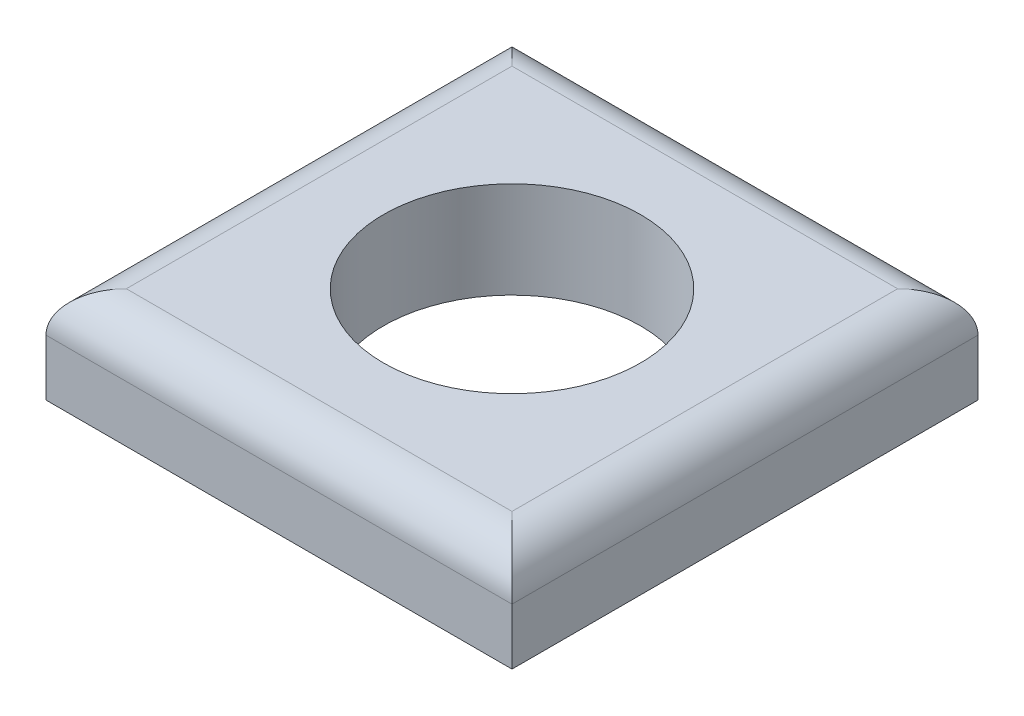
ISO-10303-21;
HEADER;
FILE_DESCRIPTION(('STEP AP214'),'2;1');
FILE_NAME('part.step','',(''),(''),'','','');
FILE_SCHEMA(('AUTOMOTIVE_DESIGN { 1 0 10303 214 1 1 1 1 }'));
ENDSEC;
DATA;
#1=APPLICATION_CONTEXT('core data for automotive mechanical design processes');
#2=APPLICATION_PROTOCOL_DEFINITION('international standard','automotive_design',2000,#1);
#3=PRODUCT_CONTEXT('',#1,'mechanical');
#4=PRODUCT('Part','Part','',(#3));
#5=PRODUCT_RELATED_PRODUCT_CATEGORY('part','',(#4));
#6=PRODUCT_DEFINITION_FORMATION('','',#4);
#7=PRODUCT_DEFINITION_CONTEXT('part definition',#1,'design');
#8=PRODUCT_DEFINITION('design','',#6,#7);
#9=PRODUCT_DEFINITION_SHAPE('','',#8);
#10=(LENGTH_UNIT() NAMED_UNIT(*) SI_UNIT(.MILLI.,.METRE.));
#11=(NAMED_UNIT(*) PLANE_ANGLE_UNIT() SI_UNIT($,.RADIAN.));
#12=(NAMED_UNIT(*) SI_UNIT($,.STERADIAN.) SOLID_ANGLE_UNIT());
#13=UNCERTAINTY_MEASURE_WITH_UNIT(LENGTH_MEASURE(1.E-05),#10,'distance_accuracy_value','');
#14=(GEOMETRIC_REPRESENTATION_CONTEXT(3) GLOBAL_UNCERTAINTY_ASSIGNED_CONTEXT((#13)) GLOBAL_UNIT_ASSIGNED_CONTEXT((#10,
#11,#12)) REPRESENTATION_CONTEXT('',''));
#15=CARTESIAN_POINT('',(0.,0.,0.));
#16=DIRECTION('',(0.,0.,1.));
#17=DIRECTION('',(1.,0.,0.));
#18=AXIS2_PLACEMENT_3D('',#15,#16,#17);
#19=CARTESIAN_POINT('',(-2.9,1.2,-2.9));
#20=DIRECTION('',(1.,0.,0.));
#21=DIRECTION('',(0.,0.,-1.));
#22=AXIS2_PLACEMENT_3D('',#19,#20,#21);
#23=PLANE('',#22);
#24=DIRECTION('',(0.,-1.,0.));
#25=VECTOR('',#24,1.);
#26=CARTESIAN_POINT('',(-2.9,1.2,2.9));
#27=LINE('',#26,#25);
#28=CARTESIAN_POINT('',(-2.9,0.7,2.9));
#29=VERTEX_POINT('',#28);
#30=CARTESIAN_POINT('',(-2.9,0.,2.9));
#31=VERTEX_POINT('',#30);
#32=EDGE_CURVE('E82',#29,#31,#27,.T.);
#33=ORIENTED_EDGE('',*,*,#32,.F.);
#34=DIRECTION('',(0.,0.,1.));
#35=VECTOR('',#34,1.);
#36=CARTESIAN_POINT('',(-2.9,0.7,-2.9));
#37=LINE('',#36,#35);
#38=CARTESIAN_POINT('',(-2.9,0.7,-2.9));
#39=VERTEX_POINT('',#38);
#40=EDGE_CURVE('E11',#29,#39,#37,.F.);
#41=ORIENTED_EDGE('',*,*,#40,.T.);
#42=DIRECTION('',(0.,-1.,0.));
#43=VECTOR('',#42,1.);
#44=CARTESIAN_POINT('',(-2.9,1.2,-2.9));
#45=LINE('',#44,#43);
#46=CARTESIAN_POINT('',(-2.9,0.,-2.9));
#47=VERTEX_POINT('',#46);
#48=EDGE_CURVE('E102',#39,#47,#45,.T.);
#49=ORIENTED_EDGE('',*,*,#48,.T.);
#50=DIRECTION('',(0.,0.,1.));
#51=VECTOR('',#50,1.);
#52=CARTESIAN_POINT('',(-2.9,0.,-2.9));
#53=LINE('',#52,#51);
#54=EDGE_CURVE('E98',#47,#31,#53,.T.);
#55=ORIENTED_EDGE('',*,*,#54,.T.);
#56=EDGE_LOOP('',(#33,#41,#49,#55));
#57=FACE_BOUND('',#56,.T.);
#58=ADVANCED_FACE('F32',(#57),#23,.F.);
#59=CARTESIAN_POINT('',(-2.9,1.2,2.9));
#60=DIRECTION('',(0.,0.,-1.));
#61=DIRECTION('',(-1.,0.,0.));
#62=AXIS2_PLACEMENT_3D('',#59,#60,#61);
#63=PLANE('',#62);
#64=DIRECTION('',(0.,-1.,0.));
#65=VECTOR('',#64,1.);
#66=CARTESIAN_POINT('',(2.9,1.2,2.9));
#67=LINE('',#66,#65);
#68=CARTESIAN_POINT('',(2.9,0.7,2.9));
#69=VERTEX_POINT('',#68);
#70=CARTESIAN_POINT('',(2.9,0.,2.9));
#71=VERTEX_POINT('',#70);
#72=EDGE_CURVE('E92',#69,#71,#67,.T.);
#73=ORIENTED_EDGE('',*,*,#72,.F.);
#74=DIRECTION('',(1.,0.,0.));
#75=VECTOR('',#74,1.);
#76=CARTESIAN_POINT('',(-2.9,0.7,2.9));
#77=LINE('',#76,#75);
#78=EDGE_CURVE('E89',#69,#29,#77,.F.);
#79=ORIENTED_EDGE('',*,*,#78,.T.);
#80=ORIENTED_EDGE('',*,*,#32,.T.);
#81=DIRECTION('',(1.,0.,0.));
#82=VECTOR('',#81,1.);
#83=CARTESIAN_POINT('',(-2.9,0.,2.9));
#84=LINE('',#83,#82);
#85=EDGE_CURVE('E86',#31,#71,#84,.T.);
#86=ORIENTED_EDGE('',*,*,#85,.T.);
#87=EDGE_LOOP('',(#73,#79,#80,#86));
#88=FACE_BOUND('',#87,.T.);
#89=ADVANCED_FACE('F85',(#88),#63,.F.);
#90=CARTESIAN_POINT('',(2.9,1.2,-2.9));
#91=DIRECTION('',(-1.,0.,0.));
#92=DIRECTION('',(0.,0.,1.));
#93=AXIS2_PLACEMENT_3D('',#90,#91,#92);
#94=PLANE('',#93);
#95=DIRECTION('',(0.,-1.,0.));
#96=VECTOR('',#95,1.);
#97=CARTESIAN_POINT('',(2.9,1.2,-2.9));
#98=LINE('',#97,#96);
#99=CARTESIAN_POINT('',(2.9,0.7,-2.9));
#100=VERTEX_POINT('',#99);
#101=CARTESIAN_POINT('',(2.9,0.,-2.9));
#102=VERTEX_POINT('',#101);
#103=EDGE_CURVE('E115',#100,#102,#98,.T.);
#104=ORIENTED_EDGE('',*,*,#103,.F.);
#105=DIRECTION('',(0.,0.,-1.));
#106=VECTOR('',#105,1.);
#107=CARTESIAN_POINT('',(2.9,0.7,2.9));
#108=LINE('',#107,#106);
#109=EDGE_CURVE('E127',#100,#69,#108,.F.);
#110=ORIENTED_EDGE('',*,*,#109,.T.);
#111=ORIENTED_EDGE('',*,*,#72,.T.);
#112=DIRECTION('',(0.,0.,-1.));
#113=VECTOR('',#112,1.);
#114=CARTESIAN_POINT('',(2.9,0.,-2.9));
#115=LINE('',#114,#113);
#116=EDGE_CURVE('E100',#71,#102,#115,.T.);
#117=ORIENTED_EDGE('',*,*,#116,.T.);
#118=EDGE_LOOP('',(#104,#110,#111,#117));
#119=FACE_BOUND('',#118,.T.);
#120=ADVANCED_FACE('F130',(#119),#94,.F.);
#121=CARTESIAN_POINT('',(-2.9,1.2,-2.9));
#122=DIRECTION('',(0.,0.,1.));
#123=DIRECTION('',(1.,0.,0.));
#124=AXIS2_PLACEMENT_3D('',#121,#122,#123);
#125=PLANE('',#124);
#126=ORIENTED_EDGE('',*,*,#48,.F.);
#127=DIRECTION('',(-1.,0.,0.));
#128=VECTOR('',#127,1.);
#129=CARTESIAN_POINT('',(2.9,0.7,-2.9));
#130=LINE('',#129,#128);
#131=EDGE_CURVE('E39',#39,#100,#130,.F.);
#132=ORIENTED_EDGE('',*,*,#131,.T.);
#133=ORIENTED_EDGE('',*,*,#103,.T.);
#134=DIRECTION('',(-1.,0.,0.));
#135=VECTOR('',#134,1.);
#136=CARTESIAN_POINT('',(-2.9,0.,-2.9));
#137=LINE('',#136,#135);
#138=EDGE_CURVE('E112',#102,#47,#137,.T.);
#139=ORIENTED_EDGE('',*,*,#138,.T.);
#140=EDGE_LOOP('',(#126,#132,#133,#139));
#141=FACE_BOUND('',#140,.T.);
#142=ADVANCED_FACE('F157',(#141),#125,.F.);
#143=CARTESIAN_POINT('',(-2.9,1.2,2.9));
#144=DIRECTION('',(0.,1.,0.));
#145=DIRECTION('',(0.,0.,1.));
#146=AXIS2_PLACEMENT_3D('',#143,#144,#145);
#147=PLANE('',#146);
#148=DIRECTION('',(0.,0.,1.));
#149=VECTOR('',#148,1.);
#150=CARTESIAN_POINT('',(-2.4,1.2,2.9));
#151=LINE('',#150,#149);
#152=CARTESIAN_POINT('',(-2.4,1.2,-2.4));
#153=VERTEX_POINT('',#152);
#154=CARTESIAN_POINT('',(-2.4,1.2,2.4));
#155=VERTEX_POINT('',#154);
#156=EDGE_CURVE('E91',#153,#155,#151,.T.);
#157=ORIENTED_EDGE('',*,*,#156,.T.);
#158=DIRECTION('',(1.,0.,0.));
#159=VECTOR('',#158,1.);
#160=CARTESIAN_POINT('',(2.9,1.2,2.4));
#161=LINE('',#160,#159);
#162=CARTESIAN_POINT('',(2.4,1.2,2.4));
#163=VERTEX_POINT('',#162);
#164=EDGE_CURVE('E123',#155,#163,#161,.T.);
#165=ORIENTED_EDGE('',*,*,#164,.T.);
#166=DIRECTION('',(0.,0.,-1.));
#167=VECTOR('',#166,1.);
#168=CARTESIAN_POINT('',(2.4,1.2,-2.9));
#169=LINE('',#168,#167);
#170=CARTESIAN_POINT('',(2.4,1.2,-2.4));
#171=VERTEX_POINT('',#170);
#172=EDGE_CURVE('E121',#163,#171,#169,.T.);
#173=ORIENTED_EDGE('',*,*,#172,.T.);
#174=DIRECTION('',(-1.,0.,0.));
#175=VECTOR('',#174,1.);
#176=CARTESIAN_POINT('',(-2.9,1.2,-2.4));
#177=LINE('',#176,#175);
#178=EDGE_CURVE('E119',#171,#153,#177,.T.);
#179=ORIENTED_EDGE('',*,*,#178,.T.);
#180=EDGE_LOOP('',(#157,#165,#173,#179));
#181=FACE_BOUND('',#180,.T.);
#182=CARTESIAN_POINT('',(0.,1.2,0.));
#183=DIRECTION('',(0.,1.,0.));
#184=DIRECTION('',(0.,0.,1.));
#185=AXIS2_PLACEMENT_3D('',#182,#183,#184);
#186=CIRCLE('',#185,1.6);
#187=CARTESIAN_POINT('',(0.,1.2,1.6));
#188=VERTEX_POINT('',#187);
#189=EDGE_CURVE('E107',#188,#188,#186,.T.);
#190=ORIENTED_EDGE('',*,*,#189,.F.);
#191=EDGE_LOOP('',(#190));
#192=FACE_BOUND('',#191,.T.);
#193=ADVANCED_FACE('F155',(#181,#192),#147,.T.);
#194=CARTESIAN_POINT('',(-2.9,0.,2.9));
#195=DIRECTION('',(0.,1.,0.));
#196=DIRECTION('',(0.,0.,1.));
#197=AXIS2_PLACEMENT_3D('',#194,#195,#196);
#198=PLANE('',#197);
#199=CARTESIAN_POINT('',(0.,0.,0.));
#200=DIRECTION('',(0.,1.,0.));
#201=DIRECTION('',(0.,0.,1.));
#202=AXIS2_PLACEMENT_3D('',#199,#200,#201);
#203=CIRCLE('',#202,1.6);
#204=CARTESIAN_POINT('',(0.,0.,1.6));
#205=VERTEX_POINT('',#204);
#206=EDGE_CURVE('E104',#205,#205,#203,.T.);
#207=ORIENTED_EDGE('',*,*,#206,.T.);
#208=EDGE_LOOP('',(#207));
#209=FACE_BOUND('',#208,.T.);
#210=ORIENTED_EDGE('',*,*,#54,.F.);
#211=ORIENTED_EDGE('',*,*,#138,.F.);
#212=ORIENTED_EDGE('',*,*,#116,.F.);
#213=ORIENTED_EDGE('',*,*,#85,.F.);
#214=EDGE_LOOP('',(#210,#211,#212,#213));
#215=FACE_BOUND('',#214,.T.);
#216=ADVANCED_FACE('F96',(#209,#215),#198,.F.);
#217=CARTESIAN_POINT('',(0.,0.,0.));
#218=DIRECTION('',(0.,1.,0.));
#219=DIRECTION('',(0.,0.,1.));
#220=AXIS2_PLACEMENT_3D('',#217,#218,#219);
#221=CYLINDRICAL_SURFACE('',#220,1.6);
#222=ORIENTED_EDGE('',*,*,#206,.F.);
#223=EDGE_LOOP('',(#222));
#224=FACE_BOUND('',#223,.T.);
#225=ORIENTED_EDGE('',*,*,#189,.T.);
#226=EDGE_LOOP('',(#225));
#227=FACE_BOUND('',#226,.T.);
#228=ADVANCED_FACE('F153',(#224,#227),#221,.F.);
#229=CARTESIAN_POINT('',(-2.9,0.7,-2.4));
#230=DIRECTION('',(1.,0.,0.));
#231=DIRECTION('',(0.,0.,-1.));
#232=AXIS2_PLACEMENT_3D('',#229,#230,#231);
#233=CYLINDRICAL_SURFACE('',#232,0.5);
#234=CARTESIAN_POINT('',(2.4,0.7,-2.4));
#235=DIRECTION('',(0.707106781186548,0.,0.707106781186547));
#236=DIRECTION('',(0.707106781186547,0.,-0.707106781186548));
#237=AXIS2_PLACEMENT_3D('',#234,#235,#236);
#238=ELLIPSE('',#237,0.707106781186548,0.5);
#239=EDGE_CURVE('E144',#100,#171,#238,.T.);
#240=ORIENTED_EDGE('',*,*,#239,.F.);
#241=ORIENTED_EDGE('',*,*,#131,.F.);
#242=CARTESIAN_POINT('',(-2.4,0.7,-2.4));
#243=DIRECTION('',(0.707106781186547,0.,-0.707106781186548));
#244=DIRECTION('',(-0.707106781186548,0.,-0.707106781186547));
#245=AXIS2_PLACEMENT_3D('',#242,#243,#244);
#246=ELLIPSE('',#245,0.707106781186548,0.5);
#247=EDGE_CURVE('E148',#153,#39,#246,.F.);
#248=ORIENTED_EDGE('',*,*,#247,.F.);
#249=ORIENTED_EDGE('',*,*,#178,.F.);
#250=EDGE_LOOP('',(#240,#241,#248,#249));
#251=FACE_BOUND('',#250,.T.);
#252=ADVANCED_FACE('F191',(#251),#233,.T.);
#253=CARTESIAN_POINT('',(-2.4,0.7,2.9));
#254=DIRECTION('',(0.,0.,-1.));
#255=DIRECTION('',(-1.,0.,0.));
#256=AXIS2_PLACEMENT_3D('',#253,#254,#255);
#257=CYLINDRICAL_SURFACE('',#256,0.5);
#258=ORIENTED_EDGE('',*,*,#247,.T.);
#259=ORIENTED_EDGE('',*,*,#40,.F.);
#260=CARTESIAN_POINT('',(-2.4,0.7,2.4));
#261=DIRECTION('',(-0.707106781186548,0.,-0.707106781186547));
#262=DIRECTION('',(0.707106781186547,0.,-0.707106781186548));
#263=AXIS2_PLACEMENT_3D('',#260,#261,#262);
#264=ELLIPSE('',#263,0.707106781186547,0.5);
#265=EDGE_CURVE('E141',#155,#29,#264,.F.);
#266=ORIENTED_EDGE('',*,*,#265,.F.);
#267=ORIENTED_EDGE('',*,*,#156,.F.);
#268=EDGE_LOOP('',(#258,#259,#266,#267));
#269=FACE_BOUND('',#268,.T.);
#270=ADVANCED_FACE('F196',(#269),#257,.T.);
#271=CARTESIAN_POINT('',(2.4,0.7,2.9));
#272=DIRECTION('',(0.,0.,1.));
#273=DIRECTION('',(1.,0.,0.));
#274=AXIS2_PLACEMENT_3D('',#271,#272,#273);
#275=CYLINDRICAL_SURFACE('',#274,0.5);
#276=ORIENTED_EDGE('',*,*,#239,.T.);
#277=ORIENTED_EDGE('',*,*,#172,.F.);
#278=CARTESIAN_POINT('',(2.4,0.7,2.4));
#279=DIRECTION('',(-0.707106781186547,0.,0.707106781186548));
#280=DIRECTION('',(0.707106781186548,0.,0.707106781186547));
#281=AXIS2_PLACEMENT_3D('',#278,#279,#280);
#282=ELLIPSE('',#281,0.707106781186547,0.5);
#283=EDGE_CURVE('E138',#69,#163,#282,.T.);
#284=ORIENTED_EDGE('',*,*,#283,.F.);
#285=ORIENTED_EDGE('',*,*,#109,.F.);
#286=EDGE_LOOP('',(#276,#277,#284,#285));
#287=FACE_BOUND('',#286,.T.);
#288=ADVANCED_FACE('F142',(#287),#275,.T.);
#289=CARTESIAN_POINT('',(-2.9,0.7,2.4));
#290=DIRECTION('',(-1.,0.,0.));
#291=DIRECTION('',(0.,0.,1.));
#292=AXIS2_PLACEMENT_3D('',#289,#290,#291);
#293=CYLINDRICAL_SURFACE('',#292,0.5);
#294=ORIENTED_EDGE('',*,*,#265,.T.);
#295=ORIENTED_EDGE('',*,*,#78,.F.);
#296=ORIENTED_EDGE('',*,*,#283,.T.);
#297=ORIENTED_EDGE('',*,*,#164,.F.);
#298=EDGE_LOOP('',(#294,#295,#296,#297));
#299=FACE_BOUND('',#298,.T.);
#300=ADVANCED_FACE('F136',(#299),#293,.T.);
#301=CLOSED_SHELL('',(#58,#89,#120,#142,#193,#216,#228,#252,#270,#288,#300));
#302=MANIFOLD_SOLID_BREP('B2',#301);
#303=ADVANCED_BREP_SHAPE_REPRESENTATION('',(#18,#302),#14);
#304=SHAPE_DEFINITION_REPRESENTATION(#9,#303);
ENDSEC;
END-ISO-10303-21;
